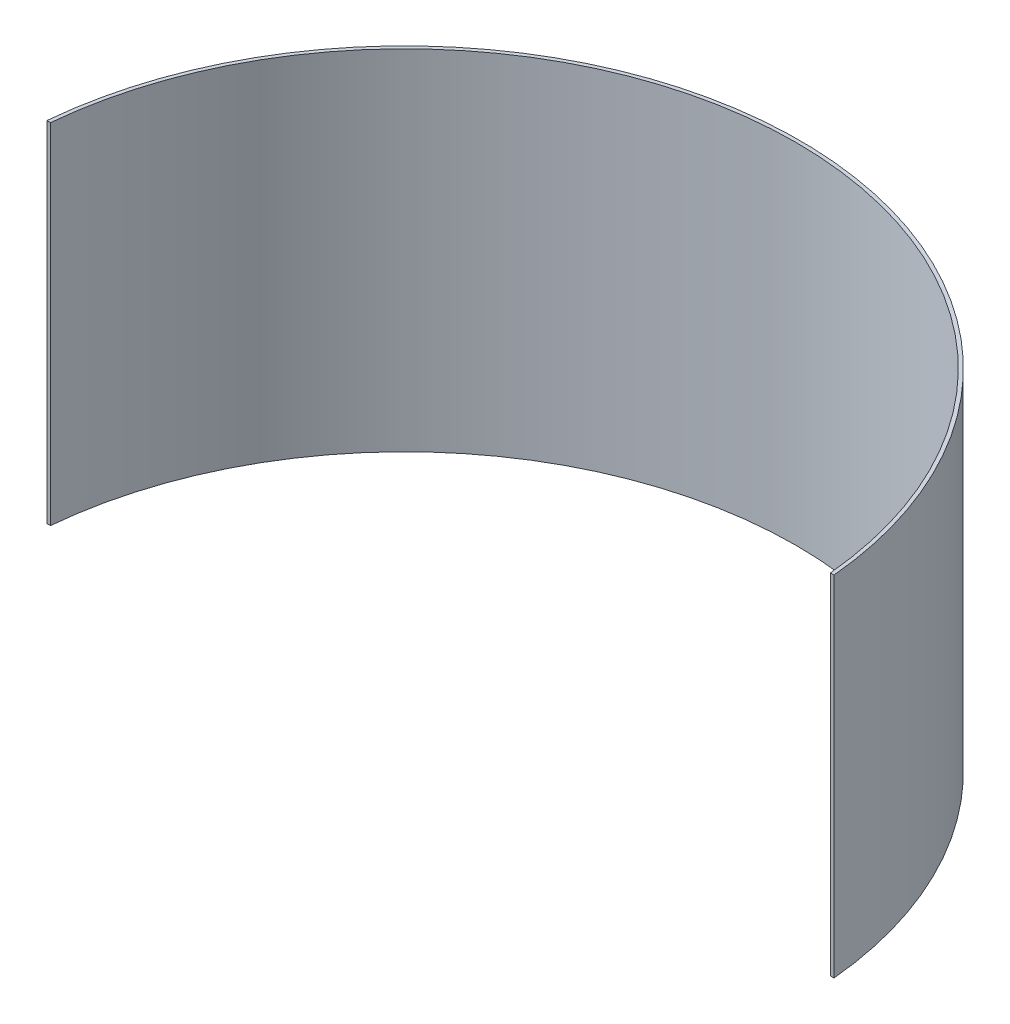
ISO-10303-21;
HEADER;
FILE_DESCRIPTION(('STEP AP214'),'2;1');
FILE_NAME('part.step','',(''),(''),'','','');
FILE_SCHEMA(('AUTOMOTIVE_DESIGN { 1 0 10303 214 1 1 1 1 }'));
ENDSEC;
DATA;
#1=APPLICATION_CONTEXT('core data for automotive mechanical design processes');
#2=APPLICATION_PROTOCOL_DEFINITION('international standard','automotive_design',2000,#1);
#3=PRODUCT_CONTEXT('',#1,'mechanical');
#4=PRODUCT('Part','Part','',(#3));
#5=PRODUCT_RELATED_PRODUCT_CATEGORY('part','',(#4));
#6=PRODUCT_DEFINITION_FORMATION('','',#4);
#7=PRODUCT_DEFINITION_CONTEXT('part definition',#1,'design');
#8=PRODUCT_DEFINITION('design','',#6,#7);
#9=PRODUCT_DEFINITION_SHAPE('','',#8);
#10=(LENGTH_UNIT() NAMED_UNIT(*) SI_UNIT(.MILLI.,.METRE.));
#11=(NAMED_UNIT(*) PLANE_ANGLE_UNIT() SI_UNIT($,.RADIAN.));
#12=(NAMED_UNIT(*) SI_UNIT($,.STERADIAN.) SOLID_ANGLE_UNIT());
#13=UNCERTAINTY_MEASURE_WITH_UNIT(LENGTH_MEASURE(1.E-05),#10,'distance_accuracy_value','');
#14=(GEOMETRIC_REPRESENTATION_CONTEXT(3) GLOBAL_UNCERTAINTY_ASSIGNED_CONTEXT((#13)) GLOBAL_UNIT_ASSIGNED_CONTEXT((#10,
#11,#12)) REPRESENTATION_CONTEXT('',''));
#15=CARTESIAN_POINT('',(0.,0.,0.));
#16=DIRECTION('',(0.,0.,1.));
#17=DIRECTION('',(1.,0.,0.));
#18=AXIS2_PLACEMENT_3D('',#15,#16,#17);
#19=CARTESIAN_POINT('',(1095.445,971.31,100.001259867065));
#20=DIRECTION('',(0.,-1.,0.));
#21=DIRECTION('',(0.,0.,-1.));
#22=AXIS2_PLACEMENT_3D('',#19,#20,#21);
#23=CYLINDRICAL_SURFACE('',#22,1100.);
#24=CARTESIAN_POINT('',(1095.445,0.,100.001259867065));
#25=DIRECTION('',(0.,1.,0.));
#26=DIRECTION('',(0.,0.,-1.));
#27=AXIS2_PLACEMENT_3D('',#24,#25,#26);
#28=CIRCLE('',#27,1100.);
#29=CARTESIAN_POINT('',(2190.89,0.,0.));
#30=VERTEX_POINT('',#29);
#31=CARTESIAN_POINT('',(0.,0.,0.));
#32=VERTEX_POINT('',#31);
#33=EDGE_CURVE('E107',#30,#32,#28,.T.);
#34=ORIENTED_EDGE('',*,*,#33,.T.);
#35=DIRECTION('',(0.,-1.,0.));
#36=VECTOR('',#35,1.);
#37=CARTESIAN_POINT('',(0.,971.31,0.));
#38=LINE('',#37,#36);
#39=CARTESIAN_POINT('',(0.,971.31,0.));
#40=VERTEX_POINT('',#39);
#41=EDGE_CURVE('E11',#40,#32,#38,.T.);
#42=ORIENTED_EDGE('',*,*,#41,.F.);
#43=CARTESIAN_POINT('',(1095.445,971.31,100.001259867065));
#44=DIRECTION('',(0.,1.,0.));
#45=DIRECTION('',(0.,0.,-1.));
#46=AXIS2_PLACEMENT_3D('',#43,#44,#45);
#47=CIRCLE('',#46,1100.);
#48=CARTESIAN_POINT('',(2190.89,971.31,0.));
#49=VERTEX_POINT('',#48);
#50=EDGE_CURVE('E91',#49,#40,#47,.T.);
#51=ORIENTED_EDGE('',*,*,#50,.F.);
#52=DIRECTION('',(0.,-1.,0.));
#53=VECTOR('',#52,1.);
#54=CARTESIAN_POINT('',(2190.89,971.31,0.));
#55=LINE('',#54,#53);
#56=EDGE_CURVE('E103',#49,#30,#55,.T.);
#57=ORIENTED_EDGE('',*,*,#56,.T.);
#58=EDGE_LOOP('',(#34,#42,#51,#57));
#59=FACE_BOUND('',#58,.T.);
#60=ADVANCED_FACE('F39',(#59),#23,.T.);
#61=CARTESIAN_POINT('',(0.,971.31,0.));
#62=DIRECTION('',(0.,0.,-1.));
#63=DIRECTION('',(-1.,0.,0.));
#64=AXIS2_PLACEMENT_3D('',#61,#62,#63);
#65=PLANE('',#64);
#66=DIRECTION('',(1.,0.,0.));
#67=VECTOR('',#66,1.);
#68=CARTESIAN_POINT('',(0.,0.,0.));
#69=LINE('',#68,#67);
#70=CARTESIAN_POINT('',(10.041965166856,0.,0.));
#71=VERTEX_POINT('',#70);
#72=EDGE_CURVE('E96',#32,#71,#69,.T.);
#73=ORIENTED_EDGE('',*,*,#72,.T.);
#74=DIRECTION('',(0.,-1.,0.));
#75=VECTOR('',#74,1.);
#76=CARTESIAN_POINT('',(10.041965166856,971.31,0.));
#77=LINE('',#76,#75);
#78=CARTESIAN_POINT('',(10.041965166856,971.31,0.));
#79=VERTEX_POINT('',#78);
#80=EDGE_CURVE('E48',#79,#71,#77,.T.);
#81=ORIENTED_EDGE('',*,*,#80,.F.);
#82=DIRECTION('',(1.,0.,0.));
#83=VECTOR('',#82,1.);
#84=CARTESIAN_POINT('',(0.,971.31,0.));
#85=LINE('',#84,#83);
#86=EDGE_CURVE('E86',#40,#79,#85,.T.);
#87=ORIENTED_EDGE('',*,*,#86,.F.);
#88=ORIENTED_EDGE('',*,*,#41,.T.);
#89=EDGE_LOOP('',(#73,#81,#87,#88));
#90=FACE_BOUND('',#89,.T.);
#91=ADVANCED_FACE('F95',(#90),#65,.F.);
#92=CARTESIAN_POINT('',(1095.445,971.31,100.001259867065));
#93=DIRECTION('',(0.,-1.,0.));
#94=DIRECTION('',(0.,0.,-1.));
#95=AXIS2_PLACEMENT_3D('',#92,#93,#94);
#96=CYLINDRICAL_SURFACE('',#95,1090.);
#97=CARTESIAN_POINT('',(1095.445,0.,100.001259867065));
#98=DIRECTION('',(0.,-1.,0.));
#99=DIRECTION('',(0.,0.,-1.));
#100=AXIS2_PLACEMENT_3D('',#97,#98,#99);
#101=CIRCLE('',#100,1090.);
#102=CARTESIAN_POINT('',(2180.84803483314,0.,1.2490009027033E-13));
#103=VERTEX_POINT('',#102);
#104=EDGE_CURVE('E73',#71,#103,#101,.T.);
#105=ORIENTED_EDGE('',*,*,#104,.T.);
#106=DIRECTION('',(0.,-1.,0.));
#107=VECTOR('',#106,1.);
#108=CARTESIAN_POINT('',(2180.84803483314,971.31,1.2490009027033E-13));
#109=LINE('',#108,#107);
#110=CARTESIAN_POINT('',(2180.84803483314,971.31,1.2490009027033E-13));
#111=VERTEX_POINT('',#110);
#112=EDGE_CURVE('E98',#111,#103,#109,.T.);
#113=ORIENTED_EDGE('',*,*,#112,.F.);
#114=CARTESIAN_POINT('',(1095.445,971.31,100.001259867065));
#115=DIRECTION('',(0.,-1.,0.));
#116=DIRECTION('',(0.,0.,-1.));
#117=AXIS2_PLACEMENT_3D('',#114,#115,#116);
#118=CIRCLE('',#117,1090.);
#119=EDGE_CURVE('E89',#79,#111,#118,.T.);
#120=ORIENTED_EDGE('',*,*,#119,.F.);
#121=ORIENTED_EDGE('',*,*,#80,.T.);
#122=EDGE_LOOP('',(#105,#113,#120,#121));
#123=FACE_BOUND('',#122,.T.);
#124=ADVANCED_FACE('F99',(#123),#96,.F.);
#125=CARTESIAN_POINT('',(2190.89,971.31,0.));
#126=DIRECTION('',(0.,0.,-1.));
#127=DIRECTION('',(-1.,0.,0.));
#128=AXIS2_PLACEMENT_3D('',#125,#126,#127);
#129=PLANE('',#128);
#130=DIRECTION('',(1.,0.,0.));
#131=VECTOR('',#130,1.);
#132=CARTESIAN_POINT('',(2190.89,0.,0.));
#133=LINE('',#132,#131);
#134=EDGE_CURVE('E79',#103,#30,#133,.T.);
#135=ORIENTED_EDGE('',*,*,#134,.T.);
#136=ORIENTED_EDGE('',*,*,#56,.F.);
#137=DIRECTION('',(1.,0.,0.));
#138=VECTOR('',#137,1.);
#139=CARTESIAN_POINT('',(2190.89,971.31,0.));
#140=LINE('',#139,#138);
#141=EDGE_CURVE('E56',#111,#49,#140,.T.);
#142=ORIENTED_EDGE('',*,*,#141,.F.);
#143=ORIENTED_EDGE('',*,*,#112,.T.);
#144=EDGE_LOOP('',(#135,#136,#142,#143));
#145=FACE_BOUND('',#144,.T.);
#146=ADVANCED_FACE('F120',(#145),#129,.F.);
#147=CARTESIAN_POINT('',(1095.445,971.31,100.001259867065));
#148=DIRECTION('',(0.,-1.,0.));
#149=DIRECTION('',(0.,0.,-1.));
#150=AXIS2_PLACEMENT_3D('',#147,#148,#149);
#151=PLANE('',#150);
#152=ORIENTED_EDGE('',*,*,#50,.T.);
#153=ORIENTED_EDGE('',*,*,#86,.T.);
#154=ORIENTED_EDGE('',*,*,#119,.T.);
#155=ORIENTED_EDGE('',*,*,#141,.T.);
#156=EDGE_LOOP('',(#152,#153,#154,#155));
#157=FACE_BOUND('',#156,.T.);
#158=ADVANCED_FACE('F87',(#157),#151,.F.);
#159=CARTESIAN_POINT('',(1095.445,0.,100.001259867065));
#160=DIRECTION('',(0.,-1.,0.));
#161=DIRECTION('',(0.,0.,-1.));
#162=AXIS2_PLACEMENT_3D('',#159,#160,#161);
#163=PLANE('',#162);
#164=ORIENTED_EDGE('',*,*,#33,.F.);
#165=ORIENTED_EDGE('',*,*,#134,.F.);
#166=ORIENTED_EDGE('',*,*,#104,.F.);
#167=ORIENTED_EDGE('',*,*,#72,.F.);
#168=EDGE_LOOP('',(#164,#165,#166,#167));
#169=FACE_BOUND('',#168,.T.);
#170=ADVANCED_FACE('F123',(#169),#163,.T.);
#171=CLOSED_SHELL('',(#60,#91,#124,#146,#158,#170));
#172=MANIFOLD_SOLID_BREP('B2',#171);
#173=ADVANCED_BREP_SHAPE_REPRESENTATION('',(#18,#172),#14);
#174=SHAPE_DEFINITION_REPRESENTATION(#9,#173);
ENDSEC;
END-ISO-10303-21;
